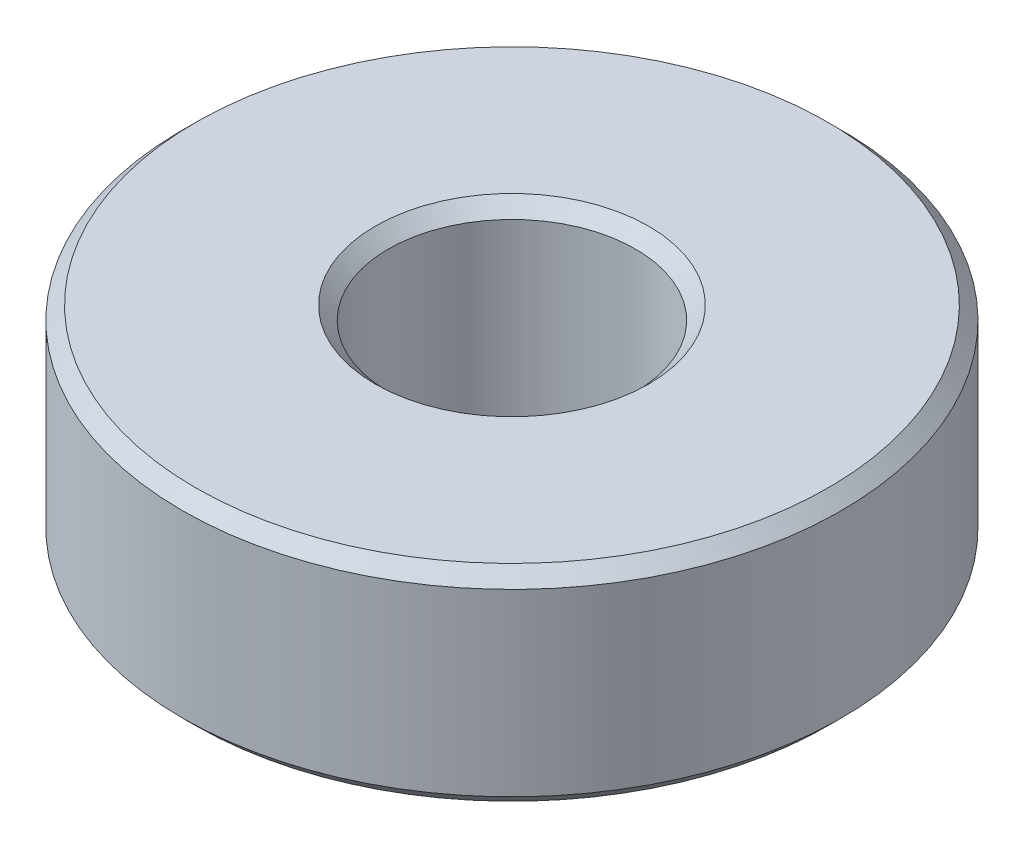
ISO-10303-21;
HEADER;
FILE_DESCRIPTION(('STEP AP214'),'2;1');
FILE_NAME('part.step','',(''),(''),'','','');
FILE_SCHEMA(('AUTOMOTIVE_DESIGN { 1 0 10303 214 1 1 1 1 }'));
ENDSEC;
DATA;
#1=APPLICATION_CONTEXT('core data for automotive mechanical design processes');
#2=APPLICATION_PROTOCOL_DEFINITION('international standard','automotive_design',2000,#1);
#3=PRODUCT_CONTEXT('',#1,'mechanical');
#4=PRODUCT('Part','Part','',(#3));
#5=PRODUCT_RELATED_PRODUCT_CATEGORY('part','',(#4));
#6=PRODUCT_DEFINITION_FORMATION('','',#4);
#7=PRODUCT_DEFINITION_CONTEXT('part definition',#1,'design');
#8=PRODUCT_DEFINITION('design','',#6,#7);
#9=PRODUCT_DEFINITION_SHAPE('','',#8);
#10=(LENGTH_UNIT() NAMED_UNIT(*) SI_UNIT(.MILLI.,.METRE.));
#11=(NAMED_UNIT(*) PLANE_ANGLE_UNIT() SI_UNIT($,.RADIAN.));
#12=(NAMED_UNIT(*) SI_UNIT($,.STERADIAN.) SOLID_ANGLE_UNIT());
#13=UNCERTAINTY_MEASURE_WITH_UNIT(LENGTH_MEASURE(1.E-05),#10,'distance_accuracy_value','');
#14=(GEOMETRIC_REPRESENTATION_CONTEXT(3) GLOBAL_UNCERTAINTY_ASSIGNED_CONTEXT((#13)) GLOBAL_UNIT_ASSIGNED_CONTEXT((#10,
#11,#12)) REPRESENTATION_CONTEXT('',''));
#15=CARTESIAN_POINT('',(0.,0.,0.));
#16=DIRECTION('',(0.,0.,1.));
#17=DIRECTION('',(1.,0.,0.));
#18=AXIS2_PLACEMENT_3D('',#15,#16,#17);
#19=CARTESIAN_POINT('',(0.,3.96875,0.));
#20=DIRECTION('',(0.,-1.,0.));
#21=DIRECTION('',(0.,0.,-1.));
#22=AXIS2_PLACEMENT_3D('',#19,#20,#21);
#23=CYLINDRICAL_SURFACE('',#22,6.35);
#24=CARTESIAN_POINT('',(0.,0.254000000000005,0.));
#25=DIRECTION('',(0.,1.,0.));
#26=DIRECTION('',(0.,0.,1.));
#27=AXIS2_PLACEMENT_3D('',#24,#25,#26);
#28=CIRCLE('',#27,6.35);
#29=CARTESIAN_POINT('',(0.,0.254000000000005,6.35));
#30=VERTEX_POINT('',#29);
#31=EDGE_CURVE('E10',#30,#30,#28,.T.);
#32=ORIENTED_EDGE('',*,*,#31,.T.);
#33=EDGE_LOOP('',(#32));
#34=FACE_BOUND('',#33,.T.);
#35=CARTESIAN_POINT('',(0.,3.71475,0.));
#36=DIRECTION('',(0.,1.,0.));
#37=DIRECTION('',(0.,0.,1.));
#38=AXIS2_PLACEMENT_3D('',#35,#36,#37);
#39=CIRCLE('',#38,6.35);
#40=CARTESIAN_POINT('',(0.,3.71475,6.35));
#41=VERTEX_POINT('',#40);
#42=EDGE_CURVE('E40',#41,#41,#39,.F.);
#43=ORIENTED_EDGE('',*,*,#42,.T.);
#44=EDGE_LOOP('',(#43));
#45=FACE_BOUND('',#44,.T.);
#46=ADVANCED_FACE('F33',(#34,#45),#23,.T.);
#47=CARTESIAN_POINT('',(0.,3.96875,0.));
#48=DIRECTION('',(0.,1.,0.));
#49=DIRECTION('',(0.,0.,1.));
#50=AXIS2_PLACEMENT_3D('',#47,#48,#49);
#51=PLANE('',#50);
#52=CARTESIAN_POINT('',(0.,3.96875,0.));
#53=DIRECTION('',(0.,1.,0.));
#54=DIRECTION('',(0.,0.,1.));
#55=AXIS2_PLACEMENT_3D('',#52,#53,#54);
#56=CIRCLE('',#55,2.63525);
#57=CARTESIAN_POINT('',(0.,3.96875,2.63525));
#58=VERTEX_POINT('',#57);
#59=EDGE_CURVE('E53',#58,#58,#56,.F.);
#60=ORIENTED_EDGE('',*,*,#59,.T.);
#61=EDGE_LOOP('',(#60));
#62=FACE_BOUND('',#61,.T.);
#63=CARTESIAN_POINT('',(0.,3.96875,0.));
#64=DIRECTION('',(0.,1.,0.));
#65=DIRECTION('',(0.,0.,1.));
#66=AXIS2_PLACEMENT_3D('',#63,#64,#65);
#67=CIRCLE('',#66,6.096);
#68=CARTESIAN_POINT('',(0.,3.96875,6.096));
#69=VERTEX_POINT('',#68);
#70=EDGE_CURVE('E56',#69,#69,#67,.T.);
#71=ORIENTED_EDGE('',*,*,#70,.T.);
#72=EDGE_LOOP('',(#71));
#73=FACE_BOUND('',#72,.T.);
#74=ADVANCED_FACE('F79',(#62,#73),#51,.T.);
#75=CARTESIAN_POINT('',(0.,0.,0.));
#76=DIRECTION('',(0.,1.,0.));
#77=DIRECTION('',(0.,0.,1.));
#78=AXIS2_PLACEMENT_3D('',#75,#76,#77);
#79=PLANE('',#78);
#80=CARTESIAN_POINT('',(0.,0.,0.));
#81=DIRECTION('',(0.,1.,0.));
#82=DIRECTION('',(0.,0.,1.));
#83=AXIS2_PLACEMENT_3D('',#80,#81,#82);
#84=CIRCLE('',#83,2.63525);
#85=CARTESIAN_POINT('',(0.,0.,2.63525));
#86=VERTEX_POINT('',#85);
#87=EDGE_CURVE('E44',#86,#86,#84,.T.);
#88=ORIENTED_EDGE('',*,*,#87,.T.);
#89=EDGE_LOOP('',(#88));
#90=FACE_BOUND('',#89,.T.);
#91=CARTESIAN_POINT('',(0.,0.,0.));
#92=DIRECTION('',(0.,1.,0.));
#93=DIRECTION('',(0.,0.,1.));
#94=AXIS2_PLACEMENT_3D('',#91,#92,#93);
#95=CIRCLE('',#94,6.09599999999999);
#96=CARTESIAN_POINT('',(0.,0.,6.09599999999999));
#97=VERTEX_POINT('',#96);
#98=EDGE_CURVE('E48',#97,#97,#95,.F.);
#99=ORIENTED_EDGE('',*,*,#98,.T.);
#100=EDGE_LOOP('',(#99));
#101=FACE_BOUND('',#100,.T.);
#102=ADVANCED_FACE('F76',(#90,#101),#79,.F.);
#103=CARTESIAN_POINT('',(0.,3.96875,0.));
#104=DIRECTION('',(0.,1.,0.));
#105=DIRECTION('',(0.,0.,1.));
#106=AXIS2_PLACEMENT_3D('',#103,#104,#105);
#107=CYLINDRICAL_SURFACE('',#106,2.38125);
#108=CARTESIAN_POINT('',(0.,3.71475,0.));
#109=DIRECTION('',(0.,1.,0.));
#110=DIRECTION('',(0.,0.,1.));
#111=AXIS2_PLACEMENT_3D('',#108,#109,#110);
#112=CIRCLE('',#111,2.38125);
#113=CARTESIAN_POINT('',(0.,3.71475,2.38125));
#114=VERTEX_POINT('',#113);
#115=EDGE_CURVE('E59',#114,#114,#112,.T.);
#116=ORIENTED_EDGE('',*,*,#115,.T.);
#117=EDGE_LOOP('',(#116));
#118=FACE_BOUND('',#117,.T.);
#119=CARTESIAN_POINT('',(0.,0.254000000000002,0.));
#120=DIRECTION('',(0.,1.,0.));
#121=DIRECTION('',(0.,0.,1.));
#122=AXIS2_PLACEMENT_3D('',#119,#120,#121);
#123=CIRCLE('',#122,2.38125);
#124=CARTESIAN_POINT('',(0.,0.254000000000002,2.38125));
#125=VERTEX_POINT('',#124);
#126=EDGE_CURVE('E62',#125,#125,#123,.F.);
#127=ORIENTED_EDGE('',*,*,#126,.T.);
#128=EDGE_LOOP('',(#127));
#129=FACE_BOUND('',#128,.T.);
#130=ADVANCED_FACE('F66',(#118,#129),#107,.F.);
#131=CARTESIAN_POINT('',(0.,3.71475,0.));
#132=DIRECTION('',(0.,1.,0.));
#133=DIRECTION('',(0.,0.,1.));
#134=AXIS2_PLACEMENT_3D('',#131,#132,#133);
#135=CONICAL_SURFACE('',#134,2.38125,0.785398163397453);
#136=ORIENTED_EDGE('',*,*,#59,.F.);
#137=EDGE_LOOP('',(#136));
#138=FACE_BOUND('',#137,.T.);
#139=ORIENTED_EDGE('',*,*,#115,.F.);
#140=EDGE_LOOP('',(#139));
#141=FACE_BOUND('',#140,.T.);
#142=ADVANCED_FACE('F72',(#138,#141),#135,.F.);
#143=CARTESIAN_POINT('',(0.,0.,0.));
#144=DIRECTION('',(0.,-1.,0.));
#145=DIRECTION('',(0.,0.,-1.));
#146=AXIS2_PLACEMENT_3D('',#143,#144,#145);
#147=CONICAL_SURFACE('',#146,2.63525,0.785398163397448);
#148=ORIENTED_EDGE('',*,*,#126,.F.);
#149=EDGE_LOOP('',(#148));
#150=FACE_BOUND('',#149,.T.);
#151=ORIENTED_EDGE('',*,*,#87,.F.);
#152=EDGE_LOOP('',(#151));
#153=FACE_BOUND('',#152,.T.);
#154=ADVANCED_FACE('F68',(#150,#153),#147,.F.);
#155=CARTESIAN_POINT('',(0.,0.254000000000005,0.));
#156=DIRECTION('',(0.,1.,0.));
#157=DIRECTION('',(0.,0.,1.));
#158=AXIS2_PLACEMENT_3D('',#155,#156,#157);
#159=CONICAL_SURFACE('',#158,6.35,0.78539816339745);
#160=ORIENTED_EDGE('',*,*,#98,.F.);
#161=EDGE_LOOP('',(#160));
#162=FACE_BOUND('',#161,.T.);
#163=ORIENTED_EDGE('',*,*,#31,.F.);
#164=EDGE_LOOP('',(#163));
#165=FACE_BOUND('',#164,.T.);
#166=ADVANCED_FACE('F71',(#162,#165),#159,.T.);
#167=CARTESIAN_POINT('',(0.,3.96875,0.));
#168=DIRECTION('',(0.,-1.,0.));
#169=DIRECTION('',(0.,0.,-1.));
#170=AXIS2_PLACEMENT_3D('',#167,#168,#169);
#171=CONICAL_SURFACE('',#170,6.096,0.785398163397443);
#172=ORIENTED_EDGE('',*,*,#42,.F.);
#173=EDGE_LOOP('',(#172));
#174=FACE_BOUND('',#173,.T.);
#175=ORIENTED_EDGE('',*,*,#70,.F.);
#176=EDGE_LOOP('',(#175));
#177=FACE_BOUND('',#176,.T.);
#178=ADVANCED_FACE('F35',(#174,#177),#171,.T.);
#179=CLOSED_SHELL('',(#46,#74,#102,#130,#142,#154,#166,#178));
#180=MANIFOLD_SOLID_BREP('B2',#179);
#181=ADVANCED_BREP_SHAPE_REPRESENTATION('',(#18,#180),#14);
#182=SHAPE_DEFINITION_REPRESENTATION(#9,#181);
ENDSEC;
END-ISO-10303-21;
